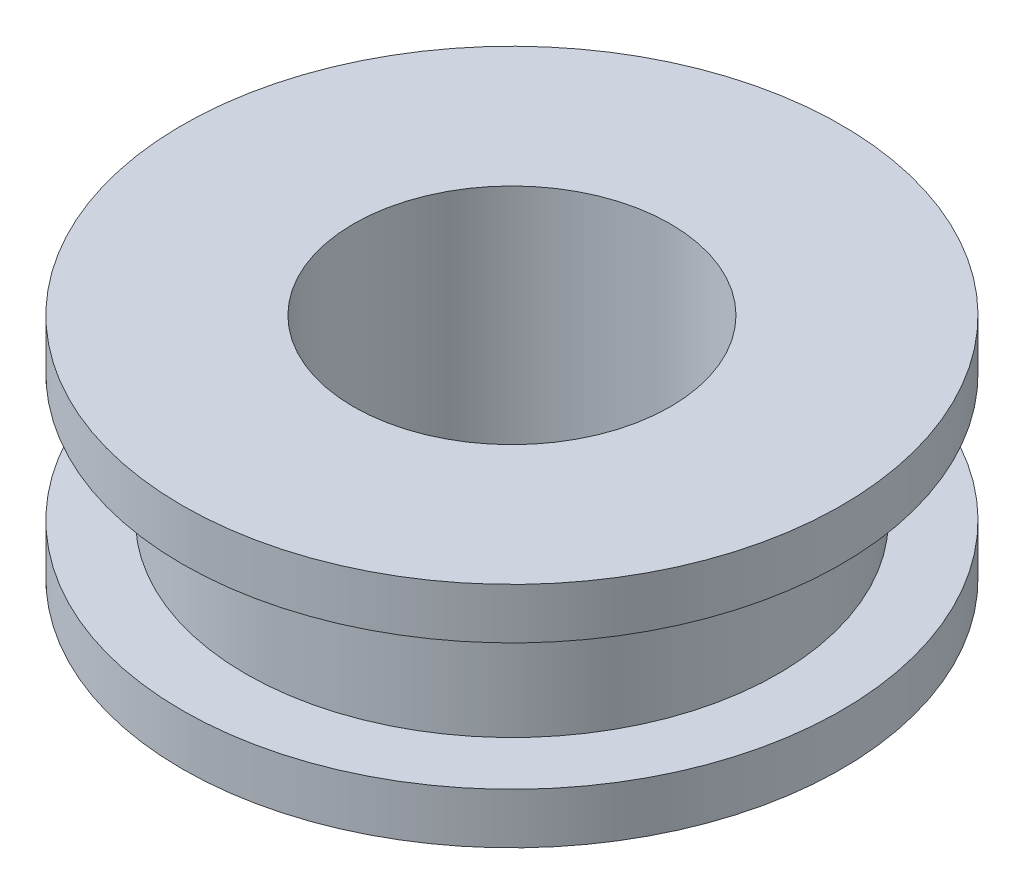
ISO-10303-21;
HEADER;
FILE_DESCRIPTION(('STEP AP214'),'2;1');
FILE_NAME('part.step','',(''),(''),'','','');
FILE_SCHEMA(('AUTOMOTIVE_DESIGN { 1 0 10303 214 1 1 1 1 }'));
ENDSEC;
DATA;
#1=APPLICATION_CONTEXT('core data for automotive mechanical design processes');
#2=APPLICATION_PROTOCOL_DEFINITION('international standard','automotive_design',2000,#1);
#3=PRODUCT_CONTEXT('',#1,'mechanical');
#4=PRODUCT('Part','Part','',(#3));
#5=PRODUCT_RELATED_PRODUCT_CATEGORY('part','',(#4));
#6=PRODUCT_DEFINITION_FORMATION('','',#4);
#7=PRODUCT_DEFINITION_CONTEXT('part definition',#1,'design');
#8=PRODUCT_DEFINITION('design','',#6,#7);
#9=PRODUCT_DEFINITION_SHAPE('','',#8);
#10=(LENGTH_UNIT() NAMED_UNIT(*) SI_UNIT(.MILLI.,.METRE.));
#11=(NAMED_UNIT(*) PLANE_ANGLE_UNIT() SI_UNIT($,.RADIAN.));
#12=(NAMED_UNIT(*) SI_UNIT($,.STERADIAN.) SOLID_ANGLE_UNIT());
#13=UNCERTAINTY_MEASURE_WITH_UNIT(LENGTH_MEASURE(1.E-05),#10,'distance_accuracy_value','');
#14=(GEOMETRIC_REPRESENTATION_CONTEXT(3) GLOBAL_UNCERTAINTY_ASSIGNED_CONTEXT((#13)) GLOBAL_UNIT_ASSIGNED_CONTEXT((#10,
#11,#12)) REPRESENTATION_CONTEXT('',''));
#15=CARTESIAN_POINT('',(0.,0.,0.));
#16=DIRECTION('',(0.,0.,1.));
#17=DIRECTION('',(1.,0.,0.));
#18=AXIS2_PLACEMENT_3D('',#15,#16,#17);
#19=CARTESIAN_POINT('',(0.,18.,0.));
#20=DIRECTION('',(0.,1.,0.));
#21=DIRECTION('',(0.,0.,1.));
#22=AXIS2_PLACEMENT_3D('',#19,#20,#21);
#23=PLANE('',#22);
#24=CARTESIAN_POINT('',(0.,18.,0.));
#25=DIRECTION('',(0.,1.,0.));
#26=DIRECTION('',(0.,0.,1.));
#27=AXIS2_PLACEMENT_3D('',#24,#25,#26);
#28=CIRCLE('',#27,52.);
#29=CARTESIAN_POINT('',(0.,18.,52.));
#30=VERTEX_POINT('',#29);
#31=EDGE_CURVE('E59',#30,#30,#28,.T.);
#32=ORIENTED_EDGE('',*,*,#31,.T.);
#33=EDGE_LOOP('',(#32));
#34=FACE_BOUND('',#33,.T.);
#35=CARTESIAN_POINT('',(0.,18.,0.));
#36=DIRECTION('',(0.,1.,0.));
#37=DIRECTION('',(0.,0.,1.));
#38=AXIS2_PLACEMENT_3D('',#35,#36,#37);
#39=CIRCLE('',#38,25.);
#40=CARTESIAN_POINT('',(0.,18.,25.));
#41=VERTEX_POINT('',#40);
#42=EDGE_CURVE('E10',#41,#41,#39,.T.);
#43=ORIENTED_EDGE('',*,*,#42,.F.);
#44=EDGE_LOOP('',(#43));
#45=FACE_BOUND('',#44,.T.);
#46=ADVANCED_FACE('F31',(#34,#45),#23,.T.);
#47=CARTESIAN_POINT('',(0.,44.3945578231292,0.));
#48=DIRECTION('',(0.,1.,0.));
#49=DIRECTION('',(0.,0.,1.));
#50=AXIS2_PLACEMENT_3D('',#47,#48,#49);
#51=CYLINDRICAL_SURFACE('',#50,25.);
#52=CARTESIAN_POINT('',(0.,-18.,0.));
#53=DIRECTION('',(0.,1.,0.));
#54=DIRECTION('',(0.,0.,1.));
#55=AXIS2_PLACEMENT_3D('',#52,#53,#54);
#56=CIRCLE('',#55,25.);
#57=CARTESIAN_POINT('',(0.,-18.,25.));
#58=VERTEX_POINT('',#57);
#59=EDGE_CURVE('E37',#58,#58,#56,.T.);
#60=ORIENTED_EDGE('',*,*,#59,.F.);
#61=EDGE_LOOP('',(#60));
#62=FACE_BOUND('',#61,.T.);
#63=ORIENTED_EDGE('',*,*,#42,.T.);
#64=EDGE_LOOP('',(#63));
#65=FACE_BOUND('',#64,.T.);
#66=ADVANCED_FACE('F77',(#62,#65),#51,.F.);
#67=CARTESIAN_POINT('',(0.,-18.,0.));
#68=DIRECTION('',(0.,-1.,0.));
#69=DIRECTION('',(0.,0.,-1.));
#70=AXIS2_PLACEMENT_3D('',#67,#68,#69);
#71=PLANE('',#70);
#72=ORIENTED_EDGE('',*,*,#59,.T.);
#73=EDGE_LOOP('',(#72));
#74=FACE_BOUND('',#73,.T.);
#75=CARTESIAN_POINT('',(0.,-18.,0.));
#76=DIRECTION('',(0.,1.,0.));
#77=DIRECTION('',(0.,0.,1.));
#78=AXIS2_PLACEMENT_3D('',#75,#76,#77);
#79=CIRCLE('',#78,52.);
#80=CARTESIAN_POINT('',(0.,-18.,52.));
#81=VERTEX_POINT('',#80);
#82=EDGE_CURVE('E41',#81,#81,#79,.T.);
#83=ORIENTED_EDGE('',*,*,#82,.F.);
#84=EDGE_LOOP('',(#83));
#85=FACE_BOUND('',#84,.T.);
#86=ADVANCED_FACE('F81',(#74,#85),#71,.T.);
#87=CARTESIAN_POINT('',(0.,44.3945578231292,0.));
#88=DIRECTION('',(0.,1.,0.));
#89=DIRECTION('',(0.,0.,1.));
#90=AXIS2_PLACEMENT_3D('',#87,#88,#89);
#91=CYLINDRICAL_SURFACE('',#90,52.);
#92=ORIENTED_EDGE('',*,*,#82,.T.);
#93=EDGE_LOOP('',(#92));
#94=FACE_BOUND('',#93,.T.);
#95=CARTESIAN_POINT('',(0.,-9.99999999999999,0.));
#96=DIRECTION('',(0.,1.,0.));
#97=DIRECTION('',(0.,0.,1.));
#98=AXIS2_PLACEMENT_3D('',#95,#96,#97);
#99=CIRCLE('',#98,52.);
#100=CARTESIAN_POINT('',(0.,-9.99999999999999,52.));
#101=VERTEX_POINT('',#100);
#102=EDGE_CURVE('E45',#101,#101,#99,.T.);
#103=ORIENTED_EDGE('',*,*,#102,.F.);
#104=EDGE_LOOP('',(#103));
#105=FACE_BOUND('',#104,.T.);
#106=ADVANCED_FACE('F86',(#94,#105),#91,.T.);
#107=CARTESIAN_POINT('',(0.,-9.99999999999999,0.));
#108=DIRECTION('',(0.,1.,0.));
#109=DIRECTION('',(0.,0.,1.));
#110=AXIS2_PLACEMENT_3D('',#107,#108,#109);
#111=PLANE('',#110);
#112=ORIENTED_EDGE('',*,*,#102,.T.);
#113=EDGE_LOOP('',(#112));
#114=FACE_BOUND('',#113,.T.);
#115=CARTESIAN_POINT('',(0.,-9.99999999999999,0.));
#116=DIRECTION('',(0.,1.,0.));
#117=DIRECTION('',(0.,0.,1.));
#118=AXIS2_PLACEMENT_3D('',#115,#116,#117);
#119=CIRCLE('',#118,42.);
#120=CARTESIAN_POINT('',(0.,-9.99999999999999,42.));
#121=VERTEX_POINT('',#120);
#122=EDGE_CURVE('E50',#121,#121,#119,.T.);
#123=ORIENTED_EDGE('',*,*,#122,.F.);
#124=EDGE_LOOP('',(#123));
#125=FACE_BOUND('',#124,.T.);
#126=ADVANCED_FACE('F91',(#114,#125),#111,.T.);
#127=CARTESIAN_POINT('',(0.,44.3945578231292,0.));
#128=DIRECTION('',(0.,1.,0.));
#129=DIRECTION('',(0.,0.,1.));
#130=AXIS2_PLACEMENT_3D('',#127,#128,#129);
#131=CYLINDRICAL_SURFACE('',#130,42.);
#132=ORIENTED_EDGE('',*,*,#122,.T.);
#133=EDGE_LOOP('',(#132));
#134=FACE_BOUND('',#133,.T.);
#135=CARTESIAN_POINT('',(0.,9.99999999999999,0.));
#136=DIRECTION('',(0.,1.,0.));
#137=DIRECTION('',(0.,0.,1.));
#138=AXIS2_PLACEMENT_3D('',#135,#136,#137);
#139=CIRCLE('',#138,42.);
#140=CARTESIAN_POINT('',(0.,9.99999999999999,42.));
#141=VERTEX_POINT('',#140);
#142=EDGE_CURVE('E53',#141,#141,#139,.T.);
#143=ORIENTED_EDGE('',*,*,#142,.F.);
#144=EDGE_LOOP('',(#143));
#145=FACE_BOUND('',#144,.T.);
#146=ADVANCED_FACE('F73',(#134,#145),#131,.T.);
#147=CARTESIAN_POINT('',(0.,9.99999999999999,0.));
#148=DIRECTION('',(0.,-1.,0.));
#149=DIRECTION('',(0.,0.,-1.));
#150=AXIS2_PLACEMENT_3D('',#147,#148,#149);
#151=PLANE('',#150);
#152=ORIENTED_EDGE('',*,*,#142,.T.);
#153=EDGE_LOOP('',(#152));
#154=FACE_BOUND('',#153,.T.);
#155=CARTESIAN_POINT('',(0.,9.99999999999999,0.));
#156=DIRECTION('',(0.,1.,0.));
#157=DIRECTION('',(0.,0.,1.));
#158=AXIS2_PLACEMENT_3D('',#155,#156,#157);
#159=CIRCLE('',#158,52.);
#160=CARTESIAN_POINT('',(0.,9.99999999999999,52.));
#161=VERTEX_POINT('',#160);
#162=EDGE_CURVE('E56',#161,#161,#159,.T.);
#163=ORIENTED_EDGE('',*,*,#162,.F.);
#164=EDGE_LOOP('',(#163));
#165=FACE_BOUND('',#164,.T.);
#166=ADVANCED_FACE('F67',(#154,#165),#151,.T.);
#167=CARTESIAN_POINT('',(0.,44.3945578231292,0.));
#168=DIRECTION('',(0.,1.,0.));
#169=DIRECTION('',(0.,0.,1.));
#170=AXIS2_PLACEMENT_3D('',#167,#168,#169);
#171=CYLINDRICAL_SURFACE('',#170,52.);
#172=ORIENTED_EDGE('',*,*,#162,.T.);
#173=EDGE_LOOP('',(#172));
#174=FACE_BOUND('',#173,.T.);
#175=ORIENTED_EDGE('',*,*,#31,.F.);
#176=EDGE_LOOP('',(#175));
#177=FACE_BOUND('',#176,.T.);
#178=ADVANCED_FACE('F65',(#174,#177),#171,.T.);
#179=CLOSED_SHELL('',(#46,#66,#86,#106,#126,#146,#166,#178));
#180=MANIFOLD_SOLID_BREP('B2',#179);
#181=ADVANCED_BREP_SHAPE_REPRESENTATION('',(#18,#180),#14);
#182=SHAPE_DEFINITION_REPRESENTATION(#9,#181);
ENDSEC;
END-ISO-10303-21;
